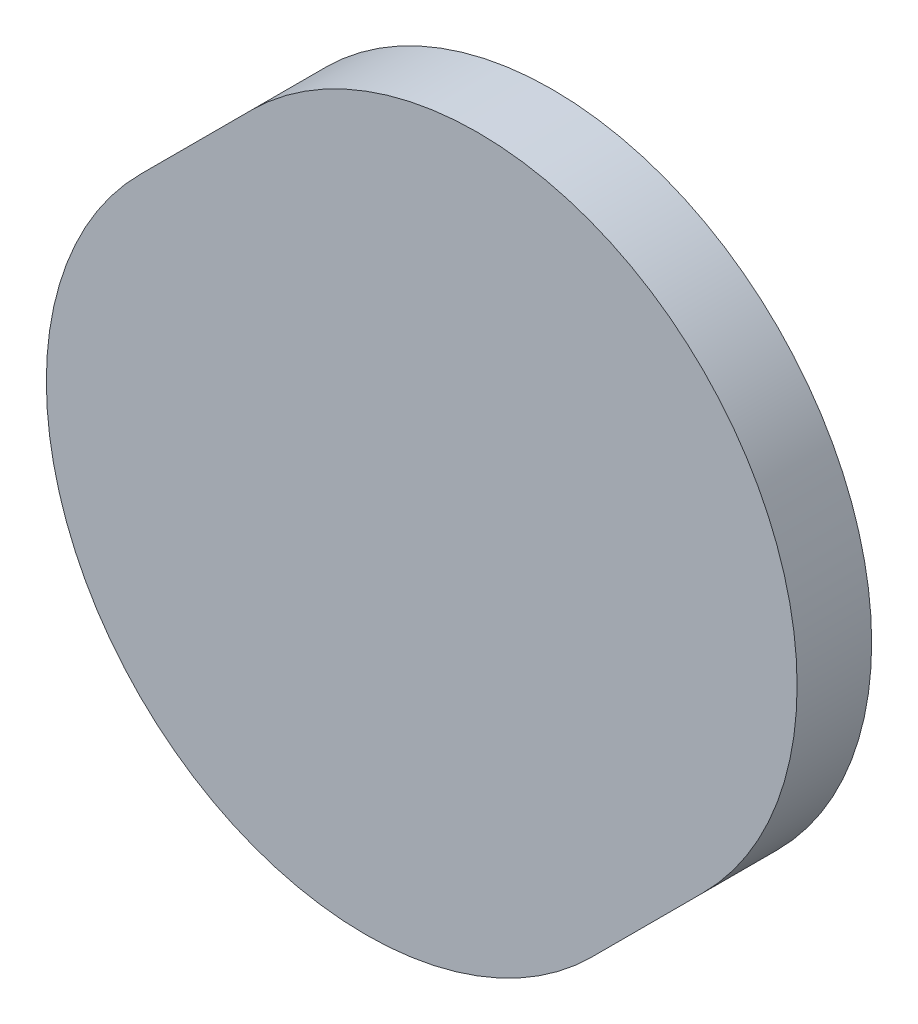
ISO-10303-21;
HEADER;
FILE_DESCRIPTION(('STEP AP214'),'2;1');
FILE_NAME('part.step','',(''),(''),'','','');
FILE_SCHEMA(('AUTOMOTIVE_DESIGN { 1 0 10303 214 1 1 1 1 }'));
ENDSEC;
DATA;
#1=APPLICATION_CONTEXT('core data for automotive mechanical design processes');
#2=APPLICATION_PROTOCOL_DEFINITION('international standard','automotive_design',2000,#1);
#3=PRODUCT_CONTEXT('',#1,'mechanical');
#4=PRODUCT('Part','Part','',(#3));
#5=PRODUCT_RELATED_PRODUCT_CATEGORY('part','',(#4));
#6=PRODUCT_DEFINITION_FORMATION('','',#4);
#7=PRODUCT_DEFINITION_CONTEXT('part definition',#1,'design');
#8=PRODUCT_DEFINITION('design','',#6,#7);
#9=PRODUCT_DEFINITION_SHAPE('','',#8);
#10=(LENGTH_UNIT() NAMED_UNIT(*) SI_UNIT(.MILLI.,.METRE.));
#11=(NAMED_UNIT(*) PLANE_ANGLE_UNIT() SI_UNIT($,.RADIAN.));
#12=(NAMED_UNIT(*) SI_UNIT($,.STERADIAN.) SOLID_ANGLE_UNIT());
#13=UNCERTAINTY_MEASURE_WITH_UNIT(LENGTH_MEASURE(1.E-05),#10,'distance_accuracy_value','');
#14=(GEOMETRIC_REPRESENTATION_CONTEXT(3) GLOBAL_UNCERTAINTY_ASSIGNED_CONTEXT((#13)) GLOBAL_UNIT_ASSIGNED_CONTEXT((#10,
#11,#12)) REPRESENTATION_CONTEXT('',''));
#15=CARTESIAN_POINT('',(0.,0.,0.));
#16=DIRECTION('',(0.,0.,1.));
#17=DIRECTION('',(1.,0.,0.));
#18=AXIS2_PLACEMENT_3D('',#15,#16,#17);
#19=CARTESIAN_POINT('',(81.566066,-112.558566,1.635));
#20=DIRECTION('',(0.,0.,1.));
#21=DIRECTION('',(1.,0.,0.));
#22=AXIS2_PLACEMENT_3D('',#19,#20,#21);
#23=PLANE('',#22);
#24=DIRECTION('',(0.707106781186548,0.707106781186548,0.));
#25=VECTOR('',#24,1.);
#26=CARTESIAN_POINT('',(81.566066,-112.558566,1.635));
#27=LINE('',#26,#25);
#28=CARTESIAN_POINT('',(81.566066,-112.558566,1.635));
#29=VERTEX_POINT('',#28);
#30=CARTESIAN_POINT('',(81.618566,-112.506066,1.635));
#31=VERTEX_POINT('',#30);
#32=EDGE_CURVE('E95',#29,#31,#27,.T.);
#33=ORIENTED_EDGE('',*,*,#32,.T.);
#34=CARTESIAN_POINT('',(81.5124995,-112.3999995,1.635));
#35=DIRECTION('',(0.,0.,1.));
#36=DIRECTION('',(0.707106781186548,-0.707106781186548,0.));
#37=AXIS2_PLACEMENT_3D('',#34,#35,#36);
#38=CIRCLE('',#37,0.150000682813);
#39=CARTESIAN_POINT('',(81.406433,-112.293933,1.635));
#40=VERTEX_POINT('',#39);
#41=EDGE_CURVE('E77',#31,#40,#38,.T.);
#42=ORIENTED_EDGE('',*,*,#41,.T.);
#43=DIRECTION('',(-0.707106781186548,-0.707106781186548,0.));
#44=VECTOR('',#43,1.);
#45=CARTESIAN_POINT('',(81.406433,-112.293933,1.635));
#46=LINE('',#45,#44);
#47=CARTESIAN_POINT('',(81.353933,-112.346433,1.635));
#48=VERTEX_POINT('',#47);
#49=EDGE_CURVE('E88',#40,#48,#46,.T.);
#50=ORIENTED_EDGE('',*,*,#49,.T.);
#51=CARTESIAN_POINT('',(81.4599995,-112.4524995,1.635));
#52=DIRECTION('',(0.,0.,1.));
#53=DIRECTION('',(-0.707106781186548,0.707106781186548,0.));
#54=AXIS2_PLACEMENT_3D('',#51,#52,#53);
#55=CIRCLE('',#54,0.150000682813);
#56=EDGE_CURVE('E11',#48,#29,#55,.T.);
#57=ORIENTED_EDGE('',*,*,#56,.T.);
#58=EDGE_LOOP('',(#33,#42,#50,#57));
#59=FACE_BOUND('',#58,.T.);
#60=ADVANCED_FACE('F17',(#59),#23,.T.);
#61=CARTESIAN_POINT('',(81.566066,-112.558566,1.6));
#62=DIRECTION('',(0.,0.,1.));
#63=DIRECTION('',(1.,0.,0.));
#64=AXIS2_PLACEMENT_3D('',#61,#62,#63);
#65=PLANE('',#64);
#66=CARTESIAN_POINT('',(81.4599995,-112.4524995,1.6));
#67=DIRECTION('',(0.,0.,1.));
#68=DIRECTION('',(-0.707106781186548,0.707106781186548,0.));
#69=AXIS2_PLACEMENT_3D('',#66,#67,#68);
#70=CIRCLE('',#69,0.150000682813);
#71=CARTESIAN_POINT('',(81.353933,-112.346433,1.6));
#72=VERTEX_POINT('',#71);
#73=CARTESIAN_POINT('',(81.566066,-112.558566,1.6));
#74=VERTEX_POINT('',#73);
#75=EDGE_CURVE('E27',#72,#74,#70,.T.);
#76=ORIENTED_EDGE('',*,*,#75,.F.);
#77=DIRECTION('',(-0.707106781186548,-0.707106781186548,0.));
#78=VECTOR('',#77,1.);
#79=CARTESIAN_POINT('',(81.406433,-112.293933,1.6));
#80=LINE('',#79,#78);
#81=CARTESIAN_POINT('',(81.406433,-112.293933,1.6));
#82=VERTEX_POINT('',#81);
#83=EDGE_CURVE('E60',#82,#72,#80,.T.);
#84=ORIENTED_EDGE('',*,*,#83,.F.);
#85=CARTESIAN_POINT('',(81.5124995,-112.3999995,1.6));
#86=DIRECTION('',(0.,0.,1.));
#87=DIRECTION('',(0.707106781186548,-0.707106781186548,0.));
#88=AXIS2_PLACEMENT_3D('',#85,#86,#87);
#89=CIRCLE('',#88,0.150000682813);
#90=CARTESIAN_POINT('',(81.618566,-112.506066,1.6));
#91=VERTEX_POINT('',#90);
#92=EDGE_CURVE('E97',#91,#82,#89,.T.);
#93=ORIENTED_EDGE('',*,*,#92,.F.);
#94=DIRECTION('',(0.707106781186548,0.707106781186548,0.));
#95=VECTOR('',#94,1.);
#96=CARTESIAN_POINT('',(81.566066,-112.558566,1.6));
#97=LINE('',#96,#95);
#98=EDGE_CURVE('E94',#74,#91,#97,.T.);
#99=ORIENTED_EDGE('',*,*,#98,.F.);
#100=EDGE_LOOP('',(#76,#84,#93,#99));
#101=FACE_BOUND('',#100,.T.);
#102=ADVANCED_FACE('F19',(#101),#65,.F.);
#103=CARTESIAN_POINT('',(81.4599995,-112.4524995,1.6));
#104=DIRECTION('',(0.,0.,-1.));
#105=DIRECTION('',(-0.707106781186548,0.707106781186548,0.));
#106=AXIS2_PLACEMENT_3D('',#103,#104,#105);
#107=CYLINDRICAL_SURFACE('',#106,0.150000682813);
#108=ORIENTED_EDGE('',*,*,#75,.T.);
#109=DIRECTION('',(0.,0.,1.));
#110=VECTOR('',#109,1.);
#111=CARTESIAN_POINT('',(81.566066,-112.558566,1.6));
#112=LINE('',#111,#110);
#113=EDGE_CURVE('E84',#74,#29,#112,.T.);
#114=ORIENTED_EDGE('',*,*,#113,.T.);
#115=ORIENTED_EDGE('',*,*,#56,.F.);
#116=DIRECTION('',(0.,0.,1.));
#117=VECTOR('',#116,1.);
#118=CARTESIAN_POINT('',(81.353933,-112.346433,1.6));
#119=LINE('',#118,#117);
#120=EDGE_CURVE('E21',#72,#48,#119,.T.);
#121=ORIENTED_EDGE('',*,*,#120,.F.);
#122=EDGE_LOOP('',(#108,#114,#115,#121));
#123=FACE_BOUND('',#122,.T.);
#124=ADVANCED_FACE('F83',(#123),#107,.T.);
#125=CARTESIAN_POINT('',(81.406433,-112.293933,1.6));
#126=DIRECTION('',(0.707106781186548,-0.707106781186548,0.));
#127=DIRECTION('',(0.,0.,-1.));
#128=AXIS2_PLACEMENT_3D('',#125,#126,#127);
#129=PLANE('',#128);
#130=ORIENTED_EDGE('',*,*,#83,.T.);
#131=ORIENTED_EDGE('',*,*,#120,.T.);
#132=ORIENTED_EDGE('',*,*,#49,.F.);
#133=DIRECTION('',(0.,0.,1.));
#134=VECTOR('',#133,1.);
#135=CARTESIAN_POINT('',(81.406433,-112.293933,1.6));
#136=LINE('',#135,#134);
#137=EDGE_CURVE('E113',#82,#40,#136,.T.);
#138=ORIENTED_EDGE('',*,*,#137,.F.);
#139=EDGE_LOOP('',(#130,#131,#132,#138));
#140=FACE_BOUND('',#139,.T.);
#141=ADVANCED_FACE('F126',(#140),#129,.F.);
#142=CARTESIAN_POINT('',(81.5124995,-112.3999995,1.6));
#143=DIRECTION('',(0.,0.,-1.));
#144=DIRECTION('',(0.707106781186548,-0.707106781186548,0.));
#145=AXIS2_PLACEMENT_3D('',#142,#143,#144);
#146=CYLINDRICAL_SURFACE('',#145,0.150000682813);
#147=ORIENTED_EDGE('',*,*,#92,.T.);
#148=ORIENTED_EDGE('',*,*,#137,.T.);
#149=ORIENTED_EDGE('',*,*,#41,.F.);
#150=DIRECTION('',(0.,0.,1.));
#151=VECTOR('',#150,1.);
#152=CARTESIAN_POINT('',(81.618566,-112.506066,1.6));
#153=LINE('',#152,#151);
#154=EDGE_CURVE('E101',#91,#31,#153,.T.);
#155=ORIENTED_EDGE('',*,*,#154,.F.);
#156=EDGE_LOOP('',(#147,#148,#149,#155));
#157=FACE_BOUND('',#156,.T.);
#158=ADVANCED_FACE('F127',(#157),#146,.T.);
#159=CARTESIAN_POINT('',(81.566066,-112.558566,1.6));
#160=DIRECTION('',(-0.707106781186548,0.707106781186548,0.));
#161=DIRECTION('',(0.,0.,1.));
#162=AXIS2_PLACEMENT_3D('',#159,#160,#161);
#163=PLANE('',#162);
#164=ORIENTED_EDGE('',*,*,#98,.T.);
#165=ORIENTED_EDGE('',*,*,#154,.T.);
#166=ORIENTED_EDGE('',*,*,#32,.F.);
#167=ORIENTED_EDGE('',*,*,#113,.F.);
#168=EDGE_LOOP('',(#164,#165,#166,#167));
#169=FACE_BOUND('',#168,.T.);
#170=ADVANCED_FACE('F92',(#169),#163,.F.);
#171=CLOSED_SHELL('',(#60,#102,#124,#141,#158,#170));
#172=MANIFOLD_SOLID_BREP('B1',#171);
#173=ADVANCED_BREP_SHAPE_REPRESENTATION('',(#18,#172),#14);
#174=SHAPE_DEFINITION_REPRESENTATION(#9,#173);
ENDSEC;
END-ISO-10303-21;
